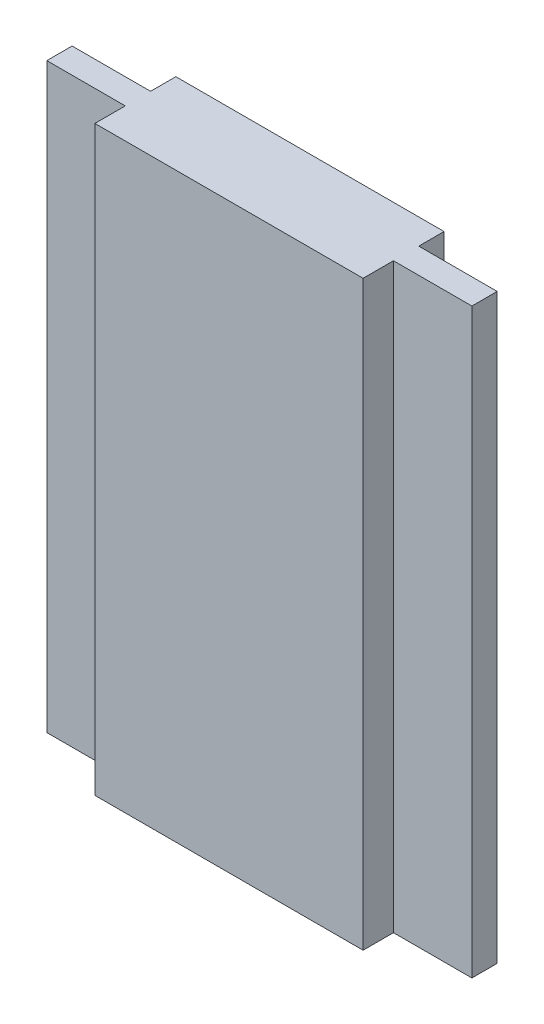
ISO-10303-21;
HEADER;
FILE_DESCRIPTION(('STEP AP214'),'2;1');
FILE_NAME('part.step','',(''),(''),'','','');
FILE_SCHEMA(('AUTOMOTIVE_DESIGN { 1 0 10303 214 1 1 1 1 }'));
ENDSEC;
DATA;
#1=APPLICATION_CONTEXT('core data for automotive mechanical design processes');
#2=APPLICATION_PROTOCOL_DEFINITION('international standard','automotive_design',2000,#1);
#3=PRODUCT_CONTEXT('',#1,'mechanical');
#4=PRODUCT('Part','Part','',(#3));
#5=PRODUCT_RELATED_PRODUCT_CATEGORY('part','',(#4));
#6=PRODUCT_DEFINITION_FORMATION('','',#4);
#7=PRODUCT_DEFINITION_CONTEXT('part definition',#1,'design');
#8=PRODUCT_DEFINITION('design','',#6,#7);
#9=PRODUCT_DEFINITION_SHAPE('','',#8);
#10=(LENGTH_UNIT() NAMED_UNIT(*) SI_UNIT(.MILLI.,.METRE.));
#11=(NAMED_UNIT(*) PLANE_ANGLE_UNIT() SI_UNIT($,.RADIAN.));
#12=(NAMED_UNIT(*) SI_UNIT($,.STERADIAN.) SOLID_ANGLE_UNIT());
#13=UNCERTAINTY_MEASURE_WITH_UNIT(LENGTH_MEASURE(1.E-05),#10,'distance_accuracy_value','');
#14=(GEOMETRIC_REPRESENTATION_CONTEXT(3) GLOBAL_UNCERTAINTY_ASSIGNED_CONTEXT((#13)) GLOBAL_UNIT_ASSIGNED_CONTEXT((#10,
#11,#12)) REPRESENTATION_CONTEXT('',''));
#15=CARTESIAN_POINT('',(0.,0.,0.));
#16=DIRECTION('',(0.,0.,1.));
#17=DIRECTION('',(1.,0.,0.));
#18=AXIS2_PLACEMENT_3D('',#15,#16,#17);
#19=CARTESIAN_POINT('',(0.,0.,15.));
#20=DIRECTION('',(0.,1.,0.));
#21=DIRECTION('',(0.,0.,1.));
#22=AXIS2_PLACEMENT_3D('',#19,#20,#21);
#23=PLANE('',#22);
#24=DIRECTION('',(0.,0.,-1.));
#25=VECTOR('',#24,1.);
#26=CARTESIAN_POINT('',(68.5,0.,15.));
#27=LINE('',#26,#25);
#28=CARTESIAN_POINT('',(68.5,0.,16.));
#29=VERTEX_POINT('',#28);
#30=CARTESIAN_POINT('',(68.5,0.,10.));
#31=VERTEX_POINT('',#30);
#32=EDGE_CURVE('E145',#29,#31,#27,.T.);
#33=ORIENTED_EDGE('',*,*,#32,.F.);
#34=DIRECTION('',(1.,0.,0.));
#35=VECTOR('',#34,1.);
#36=CARTESIAN_POINT('',(15.5,0.,16.));
#37=LINE('',#36,#35);
#38=CARTESIAN_POINT('',(15.5,0.,16.));
#39=VERTEX_POINT('',#38);
#40=EDGE_CURVE('E143',#39,#29,#37,.T.);
#41=ORIENTED_EDGE('',*,*,#40,.F.);
#42=DIRECTION('',(0.,0.,-1.));
#43=VECTOR('',#42,1.);
#44=CARTESIAN_POINT('',(15.5,0.,15.));
#45=LINE('',#44,#43);
#46=CARTESIAN_POINT('',(15.5,0.,10.));
#47=VERTEX_POINT('',#46);
#48=EDGE_CURVE('E129',#39,#47,#45,.T.);
#49=ORIENTED_EDGE('',*,*,#48,.T.);
#50=DIRECTION('',(-1.,0.,0.));
#51=VECTOR('',#50,1.);
#52=CARTESIAN_POINT('',(0.,0.,10.));
#53=LINE('',#52,#51);
#54=CARTESIAN_POINT('',(0.,0.,10.));
#55=VERTEX_POINT('',#54);
#56=EDGE_CURVE('E139',#47,#55,#53,.T.);
#57=ORIENTED_EDGE('',*,*,#56,.T.);
#58=DIRECTION('',(0.,0.,-1.));
#59=VECTOR('',#58,1.);
#60=CARTESIAN_POINT('',(0.,0.,15.));
#61=LINE('',#60,#59);
#62=CARTESIAN_POINT('',(0.,0.,5.));
#63=VERTEX_POINT('',#62);
#64=EDGE_CURVE('E11',#55,#63,#61,.T.);
#65=ORIENTED_EDGE('',*,*,#64,.T.);
#66=DIRECTION('',(-1.,0.,0.));
#67=VECTOR('',#66,1.);
#68=CARTESIAN_POINT('',(0.,0.,5.));
#69=LINE('',#68,#67);
#70=CARTESIAN_POINT('',(15.5,0.,5.));
#71=VERTEX_POINT('',#70);
#72=EDGE_CURVE('E190',#71,#63,#69,.T.);
#73=ORIENTED_EDGE('',*,*,#72,.F.);
#74=DIRECTION('',(0.,0.,1.));
#75=VECTOR('',#74,1.);
#76=CARTESIAN_POINT('',(15.5,0.,0.));
#77=LINE('',#76,#75);
#78=CARTESIAN_POINT('',(15.5,0.,0.));
#79=VERTEX_POINT('',#78);
#80=EDGE_CURVE('E192',#79,#71,#77,.T.);
#81=ORIENTED_EDGE('',*,*,#80,.F.);
#82=DIRECTION('',(1.,0.,0.));
#83=VECTOR('',#82,1.);
#84=CARTESIAN_POINT('',(0.,0.,0.));
#85=LINE('',#84,#83);
#86=CARTESIAN_POINT('',(68.5,0.,0.));
#87=VERTEX_POINT('',#86);
#88=EDGE_CURVE('E212',#79,#87,#85,.T.);
#89=ORIENTED_EDGE('',*,*,#88,.T.);
#90=DIRECTION('',(0.,0.,1.));
#91=VECTOR('',#90,1.);
#92=CARTESIAN_POINT('',(68.5,0.,0.));
#93=LINE('',#92,#91);
#94=CARTESIAN_POINT('',(68.5,0.,5.));
#95=VERTEX_POINT('',#94);
#96=EDGE_CURVE('E172',#87,#95,#93,.T.);
#97=ORIENTED_EDGE('',*,*,#96,.T.);
#98=DIRECTION('',(1.,0.,0.));
#99=VECTOR('',#98,1.);
#100=CARTESIAN_POINT('',(84.,0.,5.));
#101=LINE('',#100,#99);
#102=CARTESIAN_POINT('',(84.,0.,5.));
#103=VERTEX_POINT('',#102);
#104=EDGE_CURVE('E175',#95,#103,#101,.T.);
#105=ORIENTED_EDGE('',*,*,#104,.T.);
#106=DIRECTION('',(0.,0.,-1.));
#107=VECTOR('',#106,1.);
#108=CARTESIAN_POINT('',(84.,0.,15.));
#109=LINE('',#108,#107);
#110=CARTESIAN_POINT('',(84.,0.,10.));
#111=VERTEX_POINT('',#110);
#112=EDGE_CURVE('E45',#111,#103,#109,.T.);
#113=ORIENTED_EDGE('',*,*,#112,.F.);
#114=DIRECTION('',(1.,0.,0.));
#115=VECTOR('',#114,1.);
#116=CARTESIAN_POINT('',(84.,0.,10.));
#117=LINE('',#116,#115);
#118=EDGE_CURVE('E160',#31,#111,#117,.T.);
#119=ORIENTED_EDGE('',*,*,#118,.F.);
#120=EDGE_LOOP('',(#33,#41,#49,#57,#65,#73,#81,#89,#97,#105,#113,#119));
#121=FACE_BOUND('',#120,.T.);
#122=ADVANCED_FACE('F37',(#121),#23,.F.);
#123=CARTESIAN_POINT('',(0.,115.,15.));
#124=DIRECTION('',(0.,-1.,0.));
#125=DIRECTION('',(0.,0.,-1.));
#126=AXIS2_PLACEMENT_3D('',#123,#124,#125);
#127=PLANE('',#126);
#128=DIRECTION('',(0.,0.,-1.));
#129=VECTOR('',#128,1.);
#130=CARTESIAN_POINT('',(68.5,115.,15.));
#131=LINE('',#130,#129);
#132=CARTESIAN_POINT('',(68.5,115.,16.));
#133=VERTEX_POINT('',#132);
#134=CARTESIAN_POINT('',(68.5,115.,10.));
#135=VERTEX_POINT('',#134);
#136=EDGE_CURVE('E162',#133,#135,#131,.T.);
#137=ORIENTED_EDGE('',*,*,#136,.T.);
#138=DIRECTION('',(1.,0.,0.));
#139=VECTOR('',#138,1.);
#140=CARTESIAN_POINT('',(84.,115.,10.));
#141=LINE('',#140,#139);
#142=CARTESIAN_POINT('',(84.,115.,10.));
#143=VERTEX_POINT('',#142);
#144=EDGE_CURVE('E159',#135,#143,#141,.T.);
#145=ORIENTED_EDGE('',*,*,#144,.T.);
#146=DIRECTION('',(0.,0.,-1.));
#147=VECTOR('',#146,1.);
#148=CARTESIAN_POINT('',(84.,115.,15.));
#149=LINE('',#148,#147);
#150=CARTESIAN_POINT('',(84.,115.,5.));
#151=VERTEX_POINT('',#150);
#152=EDGE_CURVE('E52',#143,#151,#149,.T.);
#153=ORIENTED_EDGE('',*,*,#152,.T.);
#154=DIRECTION('',(1.,0.,0.));
#155=VECTOR('',#154,1.);
#156=CARTESIAN_POINT('',(84.,115.,5.));
#157=LINE('',#156,#155);
#158=CARTESIAN_POINT('',(68.5,115.,5.));
#159=VERTEX_POINT('',#158);
#160=EDGE_CURVE('E176',#159,#151,#157,.T.);
#161=ORIENTED_EDGE('',*,*,#160,.F.);
#162=DIRECTION('',(0.,0.,1.));
#163=VECTOR('',#162,1.);
#164=CARTESIAN_POINT('',(68.5,115.,0.));
#165=LINE('',#164,#163);
#166=CARTESIAN_POINT('',(68.5,115.,0.));
#167=VERTEX_POINT('',#166);
#168=EDGE_CURVE('E170',#167,#159,#165,.T.);
#169=ORIENTED_EDGE('',*,*,#168,.F.);
#170=DIRECTION('',(-1.,0.,0.));
#171=VECTOR('',#170,1.);
#172=CARTESIAN_POINT('',(0.,115.,0.));
#173=LINE('',#172,#171);
#174=CARTESIAN_POINT('',(15.5,115.,0.));
#175=VERTEX_POINT('',#174);
#176=EDGE_CURVE('E59',#167,#175,#173,.T.);
#177=ORIENTED_EDGE('',*,*,#176,.T.);
#178=DIRECTION('',(0.,0.,1.));
#179=VECTOR('',#178,1.);
#180=CARTESIAN_POINT('',(15.5,115.,0.));
#181=LINE('',#180,#179);
#182=CARTESIAN_POINT('',(15.5,115.,5.));
#183=VERTEX_POINT('',#182);
#184=EDGE_CURVE('E193',#175,#183,#181,.T.);
#185=ORIENTED_EDGE('',*,*,#184,.T.);
#186=DIRECTION('',(-1.,0.,0.));
#187=VECTOR('',#186,1.);
#188=CARTESIAN_POINT('',(0.,115.,5.));
#189=LINE('',#188,#187);
#190=CARTESIAN_POINT('',(0.,115.,5.));
#191=VERTEX_POINT('',#190);
#192=EDGE_CURVE('E186',#183,#191,#189,.T.);
#193=ORIENTED_EDGE('',*,*,#192,.T.);
#194=DIRECTION('',(0.,0.,-1.));
#195=VECTOR('',#194,1.);
#196=CARTESIAN_POINT('',(0.,115.,15.));
#197=LINE('',#196,#195);
#198=CARTESIAN_POINT('',(0.,115.,10.));
#199=VERTEX_POINT('',#198);
#200=EDGE_CURVE('E217',#199,#191,#197,.T.);
#201=ORIENTED_EDGE('',*,*,#200,.F.);
#202=DIRECTION('',(-1.,0.,0.));
#203=VECTOR('',#202,1.);
#204=CARTESIAN_POINT('',(0.,115.,10.));
#205=LINE('',#204,#203);
#206=CARTESIAN_POINT('',(15.5,115.,10.));
#207=VERTEX_POINT('',#206);
#208=EDGE_CURVE('E140',#207,#199,#205,.T.);
#209=ORIENTED_EDGE('',*,*,#208,.F.);
#210=DIRECTION('',(0.,0.,-1.));
#211=VECTOR('',#210,1.);
#212=CARTESIAN_POINT('',(15.5,115.,15.));
#213=LINE('',#212,#211);
#214=CARTESIAN_POINT('',(15.5,115.,16.));
#215=VERTEX_POINT('',#214);
#216=EDGE_CURVE('E202',#215,#207,#213,.T.);
#217=ORIENTED_EDGE('',*,*,#216,.F.);
#218=DIRECTION('',(-1.,0.,0.));
#219=VECTOR('',#218,1.);
#220=CARTESIAN_POINT('',(15.5,115.,16.));
#221=LINE('',#220,#219);
#222=EDGE_CURVE('E154',#133,#215,#221,.T.);
#223=ORIENTED_EDGE('',*,*,#222,.F.);
#224=EDGE_LOOP('',(#137,#145,#153,#161,#169,#177,#185,#193,#201,#209,#217,#223));
#225=FACE_BOUND('',#224,.T.);
#226=ADVANCED_FACE('F247',(#225),#127,.F.);
#227=CARTESIAN_POINT('',(84.,0.,15.));
#228=DIRECTION('',(-1.,0.,0.));
#229=DIRECTION('',(0.,0.,1.));
#230=AXIS2_PLACEMENT_3D('',#227,#228,#229);
#231=PLANE('',#230);
#232=DIRECTION('',(0.,1.,0.));
#233=VECTOR('',#232,1.);
#234=CARTESIAN_POINT('',(84.,0.,10.));
#235=LINE('',#234,#233);
#236=EDGE_CURVE('E164',#111,#143,#235,.T.);
#237=ORIENTED_EDGE('',*,*,#236,.F.);
#238=ORIENTED_EDGE('',*,*,#112,.T.);
#239=DIRECTION('',(0.,1.,0.));
#240=VECTOR('',#239,1.);
#241=CARTESIAN_POINT('',(84.,0.,5.));
#242=LINE('',#241,#240);
#243=EDGE_CURVE('E183',#103,#151,#242,.T.);
#244=ORIENTED_EDGE('',*,*,#243,.T.);
#245=ORIENTED_EDGE('',*,*,#152,.F.);
#246=EDGE_LOOP('',(#237,#238,#244,#245));
#247=FACE_BOUND('',#246,.T.);
#248=ADVANCED_FACE('F224',(#247),#231,.F.);
#249=CARTESIAN_POINT('',(0.,0.,15.));
#250=DIRECTION('',(1.,0.,0.));
#251=DIRECTION('',(0.,0.,-1.));
#252=AXIS2_PLACEMENT_3D('',#249,#250,#251);
#253=PLANE('',#252);
#254=DIRECTION('',(0.,1.,0.));
#255=VECTOR('',#254,1.);
#256=CARTESIAN_POINT('',(0.,0.,5.));
#257=LINE('',#256,#255);
#258=EDGE_CURVE('E195',#63,#191,#257,.T.);
#259=ORIENTED_EDGE('',*,*,#258,.F.);
#260=ORIENTED_EDGE('',*,*,#64,.F.);
#261=DIRECTION('',(0.,1.,0.));
#262=VECTOR('',#261,1.);
#263=CARTESIAN_POINT('',(0.,0.,10.));
#264=LINE('',#263,#262);
#265=EDGE_CURVE('E209',#55,#199,#264,.T.);
#266=ORIENTED_EDGE('',*,*,#265,.T.);
#267=ORIENTED_EDGE('',*,*,#200,.T.);
#268=EDGE_LOOP('',(#259,#260,#266,#267));
#269=FACE_BOUND('',#268,.T.);
#270=ADVANCED_FACE('F39',(#269),#253,.F.);
#271=CARTESIAN_POINT('',(0.,0.,0.));
#272=DIRECTION('',(0.,0.,-1.));
#273=DIRECTION('',(-1.,0.,0.));
#274=AXIS2_PLACEMENT_3D('',#271,#272,#273);
#275=PLANE('',#274);
#276=DIRECTION('',(0.,1.,0.));
#277=VECTOR('',#276,1.);
#278=CARTESIAN_POINT('',(68.5,0.,0.));
#279=LINE('',#278,#277);
#280=EDGE_CURVE('E179',#87,#167,#279,.T.);
#281=ORIENTED_EDGE('',*,*,#280,.F.);
#282=ORIENTED_EDGE('',*,*,#88,.F.);
#283=DIRECTION('',(0.,1.,0.));
#284=VECTOR('',#283,1.);
#285=CARTESIAN_POINT('',(15.5,0.,0.));
#286=LINE('',#285,#284);
#287=EDGE_CURVE('E199',#79,#175,#286,.T.);
#288=ORIENTED_EDGE('',*,*,#287,.T.);
#289=ORIENTED_EDGE('',*,*,#176,.F.);
#290=EDGE_LOOP('',(#281,#282,#288,#289));
#291=FACE_BOUND('',#290,.T.);
#292=ADVANCED_FACE('F234',(#291),#275,.T.);
#293=CARTESIAN_POINT('',(0.,0.,10.));
#294=DIRECTION('',(0.,0.,-1.));
#295=DIRECTION('',(-1.,0.,0.));
#296=AXIS2_PLACEMENT_3D('',#293,#294,#295);
#297=PLANE('',#296);
#298=ORIENTED_EDGE('',*,*,#208,.T.);
#299=ORIENTED_EDGE('',*,*,#265,.F.);
#300=ORIENTED_EDGE('',*,*,#56,.F.);
#301=DIRECTION('',(0.,1.,0.));
#302=VECTOR('',#301,1.);
#303=CARTESIAN_POINT('',(15.5,0.,10.));
#304=LINE('',#303,#302);
#305=EDGE_CURVE('E135',#47,#207,#304,.T.);
#306=ORIENTED_EDGE('',*,*,#305,.T.);
#307=EDGE_LOOP('',(#298,#299,#300,#306));
#308=FACE_BOUND('',#307,.T.);
#309=ADVANCED_FACE('F249',(#308),#297,.F.);
#310=CARTESIAN_POINT('',(15.5,0.,15.));
#311=DIRECTION('',(1.,0.,0.));
#312=DIRECTION('',(0.,0.,-1.));
#313=AXIS2_PLACEMENT_3D('',#310,#311,#312);
#314=PLANE('',#313);
#315=ORIENTED_EDGE('',*,*,#216,.T.);
#316=ORIENTED_EDGE('',*,*,#305,.F.);
#317=ORIENTED_EDGE('',*,*,#48,.F.);
#318=DIRECTION('',(0.,-1.,0.));
#319=VECTOR('',#318,1.);
#320=CARTESIAN_POINT('',(15.5,115.,16.));
#321=LINE('',#320,#319);
#322=EDGE_CURVE('E134',#215,#39,#321,.T.);
#323=ORIENTED_EDGE('',*,*,#322,.F.);
#324=EDGE_LOOP('',(#315,#316,#317,#323));
#325=FACE_BOUND('',#324,.T.);
#326=ADVANCED_FACE('F132',(#325),#314,.F.);
#327=CARTESIAN_POINT('',(15.5,0.,0.));
#328=DIRECTION('',(-1.,0.,0.));
#329=DIRECTION('',(0.,0.,1.));
#330=AXIS2_PLACEMENT_3D('',#327,#328,#329);
#331=PLANE('',#330);
#332=ORIENTED_EDGE('',*,*,#184,.F.);
#333=ORIENTED_EDGE('',*,*,#287,.F.);
#334=ORIENTED_EDGE('',*,*,#80,.T.);
#335=DIRECTION('',(0.,1.,0.));
#336=VECTOR('',#335,1.);
#337=CARTESIAN_POINT('',(15.5,0.,5.));
#338=LINE('',#337,#336);
#339=EDGE_CURVE('E203',#71,#183,#338,.T.);
#340=ORIENTED_EDGE('',*,*,#339,.T.);
#341=EDGE_LOOP('',(#332,#333,#334,#340));
#342=FACE_BOUND('',#341,.T.);
#343=ADVANCED_FACE('F236',(#342),#331,.T.);
#344=CARTESIAN_POINT('',(0.,0.,5.));
#345=DIRECTION('',(0.,0.,-1.));
#346=DIRECTION('',(-1.,0.,0.));
#347=AXIS2_PLACEMENT_3D('',#344,#345,#346);
#348=PLANE('',#347);
#349=ORIENTED_EDGE('',*,*,#192,.F.);
#350=ORIENTED_EDGE('',*,*,#339,.F.);
#351=ORIENTED_EDGE('',*,*,#72,.T.);
#352=ORIENTED_EDGE('',*,*,#258,.T.);
#353=EDGE_LOOP('',(#349,#350,#351,#352));
#354=FACE_BOUND('',#353,.T.);
#355=ADVANCED_FACE('F243',(#354),#348,.T.);
#356=CARTESIAN_POINT('',(84.,0.,5.));
#357=DIRECTION('',(0.,0.,1.));
#358=DIRECTION('',(1.,0.,0.));
#359=AXIS2_PLACEMENT_3D('',#356,#357,#358);
#360=PLANE('',#359);
#361=ORIENTED_EDGE('',*,*,#160,.T.);
#362=ORIENTED_EDGE('',*,*,#243,.F.);
#363=ORIENTED_EDGE('',*,*,#104,.F.);
#364=DIRECTION('',(0.,1.,0.));
#365=VECTOR('',#364,1.);
#366=CARTESIAN_POINT('',(68.5,0.,5.));
#367=LINE('',#366,#365);
#368=EDGE_CURVE('E187',#95,#159,#367,.T.);
#369=ORIENTED_EDGE('',*,*,#368,.T.);
#370=EDGE_LOOP('',(#361,#362,#363,#369));
#371=FACE_BOUND('',#370,.T.);
#372=ADVANCED_FACE('F227',(#371),#360,.F.);
#373=CARTESIAN_POINT('',(68.5,0.,0.));
#374=DIRECTION('',(-1.,0.,0.));
#375=DIRECTION('',(0.,0.,1.));
#376=AXIS2_PLACEMENT_3D('',#373,#374,#375);
#377=PLANE('',#376);
#378=ORIENTED_EDGE('',*,*,#168,.T.);
#379=ORIENTED_EDGE('',*,*,#368,.F.);
#380=ORIENTED_EDGE('',*,*,#96,.F.);
#381=ORIENTED_EDGE('',*,*,#280,.T.);
#382=EDGE_LOOP('',(#378,#379,#380,#381));
#383=FACE_BOUND('',#382,.T.);
#384=ADVANCED_FACE('F232',(#383),#377,.F.);
#385=CARTESIAN_POINT('',(68.5,0.,15.));
#386=DIRECTION('',(1.,0.,0.));
#387=DIRECTION('',(0.,0.,-1.));
#388=AXIS2_PLACEMENT_3D('',#385,#386,#387);
#389=PLANE('',#388);
#390=ORIENTED_EDGE('',*,*,#136,.F.);
#391=DIRECTION('',(0.,1.,0.));
#392=VECTOR('',#391,1.);
#393=CARTESIAN_POINT('',(68.5,115.,16.));
#394=LINE('',#393,#392);
#395=EDGE_CURVE('E149',#29,#133,#394,.T.);
#396=ORIENTED_EDGE('',*,*,#395,.F.);
#397=ORIENTED_EDGE('',*,*,#32,.T.);
#398=DIRECTION('',(0.,1.,0.));
#399=VECTOR('',#398,1.);
#400=CARTESIAN_POINT('',(68.5,0.,10.));
#401=LINE('',#400,#399);
#402=EDGE_CURVE('E168',#31,#135,#401,.T.);
#403=ORIENTED_EDGE('',*,*,#402,.T.);
#404=EDGE_LOOP('',(#390,#396,#397,#403));
#405=FACE_BOUND('',#404,.T.);
#406=ADVANCED_FACE('F301',(#405),#389,.T.);
#407=CARTESIAN_POINT('',(84.,0.,10.));
#408=DIRECTION('',(0.,0.,1.));
#409=DIRECTION('',(1.,0.,0.));
#410=AXIS2_PLACEMENT_3D('',#407,#408,#409);
#411=PLANE('',#410);
#412=ORIENTED_EDGE('',*,*,#144,.F.);
#413=ORIENTED_EDGE('',*,*,#402,.F.);
#414=ORIENTED_EDGE('',*,*,#118,.T.);
#415=ORIENTED_EDGE('',*,*,#236,.T.);
#416=EDGE_LOOP('',(#412,#413,#414,#415));
#417=FACE_BOUND('',#416,.T.);
#418=ADVANCED_FACE('F308',(#417),#411,.T.);
#419=CARTESIAN_POINT('',(0.,0.,16.));
#420=DIRECTION('',(0.,0.,1.));
#421=DIRECTION('',(1.,0.,0.));
#422=AXIS2_PLACEMENT_3D('',#419,#420,#421);
#423=PLANE('',#422);
#424=ORIENTED_EDGE('',*,*,#322,.T.);
#425=ORIENTED_EDGE('',*,*,#40,.T.);
#426=ORIENTED_EDGE('',*,*,#395,.T.);
#427=ORIENTED_EDGE('',*,*,#222,.T.);
#428=EDGE_LOOP('',(#424,#425,#426,#427));
#429=FACE_BOUND('',#428,.T.);
#430=ADVANCED_FACE('F152',(#429),#423,.T.);
#431=CLOSED_SHELL('',(#122,#226,#248,#270,#292,#309,#326,#343,#355,#372,#384,#406,#418,#430));
#432=MANIFOLD_SOLID_BREP('B2',#431);
#433=ADVANCED_BREP_SHAPE_REPRESENTATION('',(#18,#432),#14);
#434=SHAPE_DEFINITION_REPRESENTATION(#9,#433);
ENDSEC;
END-ISO-10303-21;
